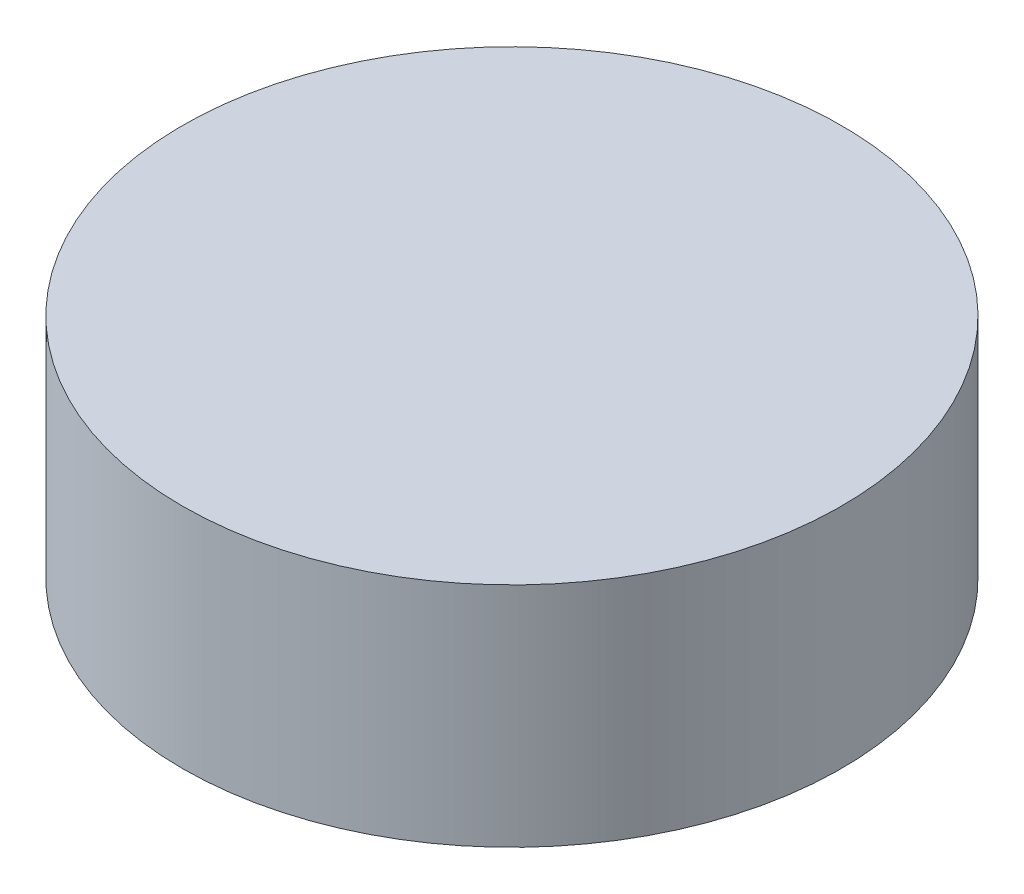
ISO-10303-21;
HEADER;
FILE_DESCRIPTION(('STEP AP214'),'2;1');
FILE_NAME('part.step','',(''),(''),'','','');
FILE_SCHEMA(('AUTOMOTIVE_DESIGN { 1 0 10303 214 1 1 1 1 }'));
ENDSEC;
DATA;
#1=APPLICATION_CONTEXT('core data for automotive mechanical design processes');
#2=APPLICATION_PROTOCOL_DEFINITION('international standard','automotive_design',2000,#1);
#3=PRODUCT_CONTEXT('',#1,'mechanical');
#4=PRODUCT('Part','Part','',(#3));
#5=PRODUCT_RELATED_PRODUCT_CATEGORY('part','',(#4));
#6=PRODUCT_DEFINITION_FORMATION('','',#4);
#7=PRODUCT_DEFINITION_CONTEXT('part definition',#1,'design');
#8=PRODUCT_DEFINITION('design','',#6,#7);
#9=PRODUCT_DEFINITION_SHAPE('','',#8);
#10=(LENGTH_UNIT() NAMED_UNIT(*) SI_UNIT(.MILLI.,.METRE.));
#11=(NAMED_UNIT(*) PLANE_ANGLE_UNIT() SI_UNIT($,.RADIAN.));
#12=(NAMED_UNIT(*) SI_UNIT($,.STERADIAN.) SOLID_ANGLE_UNIT());
#13=UNCERTAINTY_MEASURE_WITH_UNIT(LENGTH_MEASURE(1.E-05),#10,'distance_accuracy_value','');
#14=(GEOMETRIC_REPRESENTATION_CONTEXT(3) GLOBAL_UNCERTAINTY_ASSIGNED_CONTEXT((#13)) GLOBAL_UNIT_ASSIGNED_CONTEXT((#10,
#11,#12)) REPRESENTATION_CONTEXT('',''));
#15=CARTESIAN_POINT('',(0.,0.,0.));
#16=DIRECTION('',(0.,0.,1.));
#17=DIRECTION('',(1.,0.,0.));
#18=AXIS2_PLACEMENT_3D('',#15,#16,#17);
#19=CARTESIAN_POINT('',(0.,5.,0.));
#20=DIRECTION('',(0.,-1.,0.));
#21=DIRECTION('',(0.,0.,-1.));
#22=AXIS2_PLACEMENT_3D('',#19,#20,#21);
#23=CYLINDRICAL_SURFACE('',#22,7.25);
#24=CARTESIAN_POINT('',(0.,5.,0.));
#25=DIRECTION('',(0.,1.,0.));
#26=DIRECTION('',(0.,0.,1.));
#27=AXIS2_PLACEMENT_3D('',#24,#25,#26);
#28=CIRCLE('',#27,7.25);
#29=CARTESIAN_POINT('',(0.,5.,7.25));
#30=VERTEX_POINT('',#29);
#31=EDGE_CURVE('E10',#30,#30,#28,.T.);
#32=ORIENTED_EDGE('',*,*,#31,.F.);
#33=EDGE_LOOP('',(#32));
#34=FACE_BOUND('',#33,.T.);
#35=CARTESIAN_POINT('',(0.,0.,0.));
#36=DIRECTION('',(0.,1.,0.));
#37=DIRECTION('',(0.,0.,1.));
#38=AXIS2_PLACEMENT_3D('',#35,#36,#37);
#39=CIRCLE('',#38,7.25);
#40=CARTESIAN_POINT('',(0.,0.,7.25));
#41=VERTEX_POINT('',#40);
#42=EDGE_CURVE('E35',#41,#41,#39,.T.);
#43=ORIENTED_EDGE('',*,*,#42,.T.);
#44=EDGE_LOOP('',(#43));
#45=FACE_BOUND('',#44,.T.);
#46=ADVANCED_FACE('F32',(#34,#45),#23,.T.);
#47=CARTESIAN_POINT('',(0.,5.,0.));
#48=DIRECTION('',(0.,1.,0.));
#49=DIRECTION('',(0.,0.,1.));
#50=AXIS2_PLACEMENT_3D('',#47,#48,#49);
#51=PLANE('',#50);
#52=ORIENTED_EDGE('',*,*,#31,.T.);
#53=EDGE_LOOP('',(#52));
#54=FACE_BOUND('',#53,.T.);
#55=ADVANCED_FACE('F47',(#54),#51,.T.);
#56=CARTESIAN_POINT('',(0.,0.,0.));
#57=DIRECTION('',(0.,1.,0.));
#58=DIRECTION('',(0.,0.,1.));
#59=AXIS2_PLACEMENT_3D('',#56,#57,#58);
#60=PLANE('',#59);
#61=ORIENTED_EDGE('',*,*,#42,.F.);
#62=EDGE_LOOP('',(#61));
#63=FACE_BOUND('',#62,.T.);
#64=ADVANCED_FACE('F45',(#63),#60,.F.);
#65=CLOSED_SHELL('',(#46,#55,#64));
#66=MANIFOLD_SOLID_BREP('B2',#65);
#67=ADVANCED_BREP_SHAPE_REPRESENTATION('',(#18,#66),#14);
#68=SHAPE_DEFINITION_REPRESENTATION(#9,#67);
ENDSEC;
END-ISO-10303-21;
